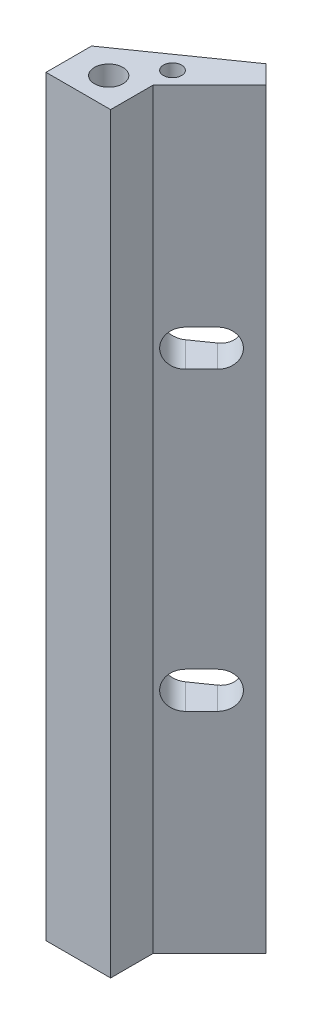
ISO-10303-21;
HEADER;
FILE_DESCRIPTION(('STEP AP214'),'2;1');
FILE_NAME('part.step','',(''),(''),'','','');
FILE_SCHEMA(('AUTOMOTIVE_DESIGN { 1 0 10303 214 1 1 1 1 }'));
ENDSEC;
DATA;
#1=APPLICATION_CONTEXT('core data for automotive mechanical design processes');
#2=APPLICATION_PROTOCOL_DEFINITION('international standard','automotive_design',2000,#1);
#3=PRODUCT_CONTEXT('',#1,'mechanical');
#4=PRODUCT('Part','Part','',(#3));
#5=PRODUCT_RELATED_PRODUCT_CATEGORY('part','',(#4));
#6=PRODUCT_DEFINITION_FORMATION('','',#4);
#7=PRODUCT_DEFINITION_CONTEXT('part definition',#1,'design');
#8=PRODUCT_DEFINITION('design','',#6,#7);
#9=PRODUCT_DEFINITION_SHAPE('','',#8);
#10=(LENGTH_UNIT() NAMED_UNIT(*) SI_UNIT(.MILLI.,.METRE.));
#11=(NAMED_UNIT(*) PLANE_ANGLE_UNIT() SI_UNIT($,.RADIAN.));
#12=(NAMED_UNIT(*) SI_UNIT($,.STERADIAN.) SOLID_ANGLE_UNIT());
#13=UNCERTAINTY_MEASURE_WITH_UNIT(LENGTH_MEASURE(1.E-05),#10,'distance_accuracy_value','');
#14=(GEOMETRIC_REPRESENTATION_CONTEXT(3) GLOBAL_UNCERTAINTY_ASSIGNED_CONTEXT((#13)) GLOBAL_UNIT_ASSIGNED_CONTEXT((#10,
#11,#12)) REPRESENTATION_CONTEXT('',''));
#15=CARTESIAN_POINT('',(0.,0.,0.));
#16=DIRECTION('',(0.,0.,1.));
#17=DIRECTION('',(1.,0.,0.));
#18=AXIS2_PLACEMENT_3D('',#15,#16,#17);
#19=CARTESIAN_POINT('',(4.6187008721053,0.,0.916833034036763));
#20=DIRECTION('',(0.707106781186548,0.,-0.707106781186548));
#21=DIRECTION('',(-0.707106781186548,0.,-0.707106781186548));
#22=AXIS2_PLACEMENT_3D('',#19,#20,#21);
#23=PLANE('',#22);
#24=DIRECTION('',(-0.707106781186548,0.,-0.707106781186548));
#25=VECTOR('',#24,1.);
#26=CARTESIAN_POINT('',(4.6187008721053,66.,0.916833034036763));
#27=LINE('',#26,#25);
#28=CARTESIAN_POINT('',(4.6187008721053,66.,0.916833034036763));
#29=VERTEX_POINT('',#28);
#30=CARTESIAN_POINT('',(2.99999999712652,66.,-0.701867840942023));
#31=VERTEX_POINT('',#30);
#32=EDGE_CURVE('E217',#29,#31,#27,.T.);
#33=ORIENTED_EDGE('',*,*,#32,.F.);
#34=DIRECTION('',(0.,1.,0.));
#35=VECTOR('',#34,1.);
#36=CARTESIAN_POINT('',(4.6187008721053,0.,0.916833034036763));
#37=LINE('',#36,#35);
#38=CARTESIAN_POINT('',(4.6187008721053,0.,0.916833034036763));
#39=VERTEX_POINT('',#38);
#40=EDGE_CURVE('E260',#39,#29,#37,.T.);
#41=ORIENTED_EDGE('',*,*,#40,.F.);
#42=DIRECTION('',(-0.707106781186548,0.,-0.707106781186548));
#43=VECTOR('',#42,1.);
#44=CARTESIAN_POINT('',(4.6187008721053,0.,0.916833034036763));
#45=LINE('',#44,#43);
#46=CARTESIAN_POINT('',(2.99999999712652,0.,-0.701867840942023));
#47=VERTEX_POINT('',#46);
#48=EDGE_CURVE('E224',#39,#47,#45,.T.);
#49=ORIENTED_EDGE('',*,*,#48,.T.);
#50=DIRECTION('',(0.,1.,0.));
#51=VECTOR('',#50,1.);
#52=CARTESIAN_POINT('',(2.99999999712652,0.,-0.701867840942023));
#53=LINE('',#52,#51);
#54=EDGE_CURVE('E243',#47,#31,#53,.T.);
#55=ORIENTED_EDGE('',*,*,#54,.T.);
#56=EDGE_LOOP('',(#33,#41,#49,#55));
#57=FACE_BOUND('',#56,.T.);
#58=ADVANCED_FACE('F32',(#57),#23,.T.);
#59=CARTESIAN_POINT('',(-0.33104659149401,0.,5.86658049763607));
#60=DIRECTION('',(0.707106781186547,0.,0.707106781186547));
#61=DIRECTION('',(0.707106781186548,0.,-0.707106781186548));
#62=AXIS2_PLACEMENT_3D('',#59,#60,#61);
#63=PLANE('',#62);
#64=CARTESIAN_POINT('',(2.49738053104314,19.999999999,3.03815337509892));
#65=DIRECTION('',(0.707106781186548,0.,0.707106781186548));
#66=DIRECTION('',(0.707106781186548,0.,-0.707106781186548));
#67=AXIS2_PLACEMENT_3D('',#64,#65,#66);
#68=CIRCLE('',#67,1.59999999207179);
#69=CARTESIAN_POINT('',(2.49738053104314,18.4000000069282,3.03815337509892));
#70=VERTEX_POINT('',#69);
#71=CARTESIAN_POINT('',(2.49738053104314,21.5999999910718,3.03815337509892));
#72=VERTEX_POINT('',#71);
#73=EDGE_CURVE('E46',#70,#72,#68,.T.);
#74=ORIENTED_EDGE('',*,*,#73,.F.);
#75=DIRECTION('',(0.707106781186547,0.,-0.707106781186548));
#76=VECTOR('',#75,1.);
#77=CARTESIAN_POINT('',(1.08316696903882,18.4000000069282,4.45236693710325));
#78=LINE('',#77,#76);
#79=CARTESIAN_POINT('',(1.08316696903882,18.4000000069282,4.45236693710325));
#80=VERTEX_POINT('',#79);
#81=EDGE_CURVE('E190',#80,#70,#78,.T.);
#82=ORIENTED_EDGE('',*,*,#81,.F.);
#83=CARTESIAN_POINT('',(1.08316696903882,19.999999999,4.45236693710325));
#84=DIRECTION('',(0.707106781186548,0.,0.707106781186548));
#85=DIRECTION('',(0.707106781186548,0.,-0.707106781186548));
#86=AXIS2_PLACEMENT_3D('',#83,#84,#85);
#87=CIRCLE('',#86,1.59999999207179);
#88=CARTESIAN_POINT('',(1.08316696903882,21.5999999910718,4.45236693710325));
#89=VERTEX_POINT('',#88);
#90=EDGE_CURVE('E187',#89,#80,#87,.T.);
#91=ORIENTED_EDGE('',*,*,#90,.F.);
#92=DIRECTION('',(-0.707106781186547,0.,0.707106781186548));
#93=VECTOR('',#92,1.);
#94=CARTESIAN_POINT('',(2.49738053104314,21.5999999910718,3.03815337509892));
#95=LINE('',#94,#93);
#96=EDGE_CURVE('E185',#72,#89,#95,.T.);
#97=ORIENTED_EDGE('',*,*,#96,.F.);
#98=EDGE_LOOP('',(#74,#82,#91,#97));
#99=FACE_BOUND('',#98,.T.);
#100=CARTESIAN_POINT('',(2.49738053104315,46.000000001,3.03815337509892));
#101=DIRECTION('',(0.707106781186548,0.,0.707106781186548));
#102=DIRECTION('',(0.707106781186548,0.,-0.707106781186548));
#103=AXIS2_PLACEMENT_3D('',#100,#101,#102);
#104=CIRCLE('',#103,1.59999999207178);
#105=CARTESIAN_POINT('',(2.49738053104315,44.4000000089282,3.03815337509892));
#106=VERTEX_POINT('',#105);
#107=CARTESIAN_POINT('',(2.49738053104315,47.5999999930718,3.03815337509892));
#108=VERTEX_POINT('',#107);
#109=EDGE_CURVE('E203',#106,#108,#104,.T.);
#110=ORIENTED_EDGE('',*,*,#109,.F.);
#111=DIRECTION('',(0.707106781186547,0.,-0.707106781186548));
#112=VECTOR('',#111,1.);
#113=CARTESIAN_POINT('',(1.08316696903882,44.4000000089282,4.45236693710325));
#114=LINE('',#113,#112);
#115=CARTESIAN_POINT('',(1.08316696903882,44.4000000089282,4.45236693710325));
#116=VERTEX_POINT('',#115);
#117=EDGE_CURVE('E211',#116,#106,#114,.T.);
#118=ORIENTED_EDGE('',*,*,#117,.F.);
#119=CARTESIAN_POINT('',(1.08316696903882,46.000000001,4.45236693710325));
#120=DIRECTION('',(0.707106781186548,0.,0.707106781186548));
#121=DIRECTION('',(0.707106781186548,0.,-0.707106781186548));
#122=AXIS2_PLACEMENT_3D('',#119,#120,#121);
#123=CIRCLE('',#122,1.59999999207178);
#124=CARTESIAN_POINT('',(1.08316696903882,47.5999999930718,4.45236693710325));
#125=VERTEX_POINT('',#124);
#126=EDGE_CURVE('E208',#125,#116,#123,.T.);
#127=ORIENTED_EDGE('',*,*,#126,.F.);
#128=DIRECTION('',(-0.707106781186547,0.,0.707106781186548));
#129=VECTOR('',#128,1.);
#130=CARTESIAN_POINT('',(2.49738053104315,47.5999999930718,3.03815337509892));
#131=LINE('',#130,#129);
#132=EDGE_CURVE('E205',#108,#125,#131,.T.);
#133=ORIENTED_EDGE('',*,*,#132,.F.);
#134=EDGE_LOOP('',(#110,#118,#127,#133));
#135=FACE_BOUND('',#134,.T.);
#136=DIRECTION('',(0.707106781186547,0.,-0.707106781186547));
#137=VECTOR('',#136,1.);
#138=CARTESIAN_POINT('',(-0.33104659149401,66.,5.86658049763607));
#139=LINE('',#138,#137);
#140=CARTESIAN_POINT('',(-0.33104659149401,66.,5.86658049763607));
#141=VERTEX_POINT('',#140);
#142=EDGE_CURVE('E228',#141,#29,#139,.T.);
#143=ORIENTED_EDGE('',*,*,#142,.F.);
#144=DIRECTION('',(0.,1.,0.));
#145=VECTOR('',#144,1.);
#146=CARTESIAN_POINT('',(-0.33104659149401,0.,5.86658049763607));
#147=LINE('',#146,#145);
#148=CARTESIAN_POINT('',(-0.33104659149401,0.,5.86658049763607));
#149=VERTEX_POINT('',#148);
#150=EDGE_CURVE('E263',#149,#141,#147,.T.);
#151=ORIENTED_EDGE('',*,*,#150,.F.);
#152=DIRECTION('',(0.707106781186547,0.,-0.707106781186547));
#153=VECTOR('',#152,1.);
#154=CARTESIAN_POINT('',(-0.33104659149401,0.,5.86658049763607));
#155=LINE('',#154,#153);
#156=EDGE_CURVE('E240',#149,#39,#155,.T.);
#157=ORIENTED_EDGE('',*,*,#156,.T.);
#158=ORIENTED_EDGE('',*,*,#40,.T.);
#159=EDGE_LOOP('',(#143,#151,#157,#158));
#160=FACE_BOUND('',#159,.T.);
#161=ADVANCED_FACE('F298',(#99,#135,#160),#63,.T.);
#162=CARTESIAN_POINT('',(-0.33104659149401,0.,9.6));
#163=DIRECTION('',(1.,0.,0.));
#164=DIRECTION('',(0.,0.,-1.));
#165=AXIS2_PLACEMENT_3D('',#162,#163,#164);
#166=PLANE('',#165);
#167=DIRECTION('',(0.,0.,-1.));
#168=VECTOR('',#167,1.);
#169=CARTESIAN_POINT('',(-0.33104659149401,66.,9.6));
#170=LINE('',#169,#168);
#171=CARTESIAN_POINT('',(-0.33104659149401,66.,9.6));
#172=VERTEX_POINT('',#171);
#173=EDGE_CURVE('E255',#172,#141,#170,.T.);
#174=ORIENTED_EDGE('',*,*,#173,.F.);
#175=DIRECTION('',(0.,1.,0.));
#176=VECTOR('',#175,1.);
#177=CARTESIAN_POINT('',(-0.33104659149401,0.,9.6));
#178=LINE('',#177,#176);
#179=CARTESIAN_POINT('',(-0.33104659149401,0.,9.6));
#180=VERTEX_POINT('',#179);
#181=EDGE_CURVE('E265',#180,#172,#178,.T.);
#182=ORIENTED_EDGE('',*,*,#181,.F.);
#183=DIRECTION('',(0.,0.,-1.));
#184=VECTOR('',#183,1.);
#185=CARTESIAN_POINT('',(-0.33104659149401,0.,9.6));
#186=LINE('',#185,#184);
#187=EDGE_CURVE('E237',#180,#149,#186,.T.);
#188=ORIENTED_EDGE('',*,*,#187,.T.);
#189=ORIENTED_EDGE('',*,*,#150,.T.);
#190=EDGE_LOOP('',(#174,#182,#188,#189));
#191=FACE_BOUND('',#190,.T.);
#192=ADVANCED_FACE('F301',(#191),#166,.T.);
#193=CARTESIAN_POINT('',(-6.,0.,9.6));
#194=DIRECTION('',(0.,0.,1.));
#195=DIRECTION('',(1.,0.,0.));
#196=AXIS2_PLACEMENT_3D('',#193,#194,#195);
#197=PLANE('',#196);
#198=DIRECTION('',(1.,0.,0.));
#199=VECTOR('',#198,1.);
#200=CARTESIAN_POINT('',(-6.,66.,9.6));
#201=LINE('',#200,#199);
#202=CARTESIAN_POINT('',(-6.,66.,9.6));
#203=VERTEX_POINT('',#202);
#204=EDGE_CURVE('E252',#203,#172,#201,.T.);
#205=ORIENTED_EDGE('',*,*,#204,.F.);
#206=DIRECTION('',(0.,1.,0.));
#207=VECTOR('',#206,1.);
#208=CARTESIAN_POINT('',(-6.,0.,9.6));
#209=LINE('',#208,#207);
#210=CARTESIAN_POINT('',(-6.,0.,9.6));
#211=VERTEX_POINT('',#210);
#212=EDGE_CURVE('E267',#211,#203,#209,.T.);
#213=ORIENTED_EDGE('',*,*,#212,.F.);
#214=DIRECTION('',(1.,0.,0.));
#215=VECTOR('',#214,1.);
#216=CARTESIAN_POINT('',(-6.,0.,9.6));
#217=LINE('',#216,#215);
#218=EDGE_CURVE('E234',#211,#180,#217,.T.);
#219=ORIENTED_EDGE('',*,*,#218,.T.);
#220=ORIENTED_EDGE('',*,*,#181,.T.);
#221=EDGE_LOOP('',(#205,#213,#219,#220));
#222=FACE_BOUND('',#221,.T.);
#223=ADVANCED_FACE('F325',(#222),#197,.T.);
#224=CARTESIAN_POINT('',(-6.,0.,5.59999999748528));
#225=DIRECTION('',(-1.,0.,0.));
#226=DIRECTION('',(0.,0.,1.));
#227=AXIS2_PLACEMENT_3D('',#224,#225,#226);
#228=PLANE('',#227);
#229=DIRECTION('',(0.,0.,1.));
#230=VECTOR('',#229,1.);
#231=CARTESIAN_POINT('',(-6.,66.,5.59999999748528));
#232=LINE('',#231,#230);
#233=CARTESIAN_POINT('',(-6.,66.,5.59999999748528));
#234=VERTEX_POINT('',#233);
#235=EDGE_CURVE('E249',#234,#203,#232,.T.);
#236=ORIENTED_EDGE('',*,*,#235,.F.);
#237=DIRECTION('',(0.,1.,0.));
#238=VECTOR('',#237,1.);
#239=CARTESIAN_POINT('',(-6.,0.,5.59999999748528));
#240=LINE('',#239,#238);
#241=CARTESIAN_POINT('',(-6.,0.,5.59999999748528));
#242=VERTEX_POINT('',#241);
#243=EDGE_CURVE('E269',#242,#234,#240,.T.);
#244=ORIENTED_EDGE('',*,*,#243,.F.);
#245=DIRECTION('',(0.,0.,1.));
#246=VECTOR('',#245,1.);
#247=CARTESIAN_POINT('',(-6.,0.,5.59999999748528));
#248=LINE('',#247,#246);
#249=EDGE_CURVE('E231',#242,#211,#248,.T.);
#250=ORIENTED_EDGE('',*,*,#249,.T.);
#251=ORIENTED_EDGE('',*,*,#212,.T.);
#252=EDGE_LOOP('',(#236,#244,#250,#251));
#253=FACE_BOUND('',#252,.T.);
#254=ADVANCED_FACE('F323',(#253),#228,.T.);
#255=CARTESIAN_POINT('',(2.99999999712652,0.,-0.701867840942023));
#256=DIRECTION('',(-0.573576436140462,0.,-0.819152044436444));
#257=DIRECTION('',(-0.819152044436444,0.,0.573576436140462));
#258=AXIS2_PLACEMENT_3D('',#255,#256,#257);
#259=PLANE('',#258);
#260=CARTESIAN_POINT('',(0.504633644647122,19.999999999,1.0454064887029));
#261=DIRECTION('',(-0.573576436140462,0.,-0.819152044436444));
#262=DIRECTION('',(0.819152044436444,0.,-0.573576436140462));
#263=AXIS2_PLACEMENT_3D('',#260,#261,#262);
#264=ELLIPSE('',#263,1.62468257104032,1.59999999207179);
#265=CARTESIAN_POINT('',(0.504633644647122,18.4000000069282,1.0454064887029));
#266=VERTEX_POINT('',#265);
#267=CARTESIAN_POINT('',(0.504633644647121,21.5999999910718,1.0454064887029));
#268=VERTEX_POINT('',#267);
#269=EDGE_CURVE('E181',#266,#268,#264,.F.);
#270=ORIENTED_EDGE('',*,*,#269,.T.);
#271=DIRECTION('',(-0.819152044436444,0.,0.573576436140462));
#272=VECTOR('',#271,1.);
#273=CARTESIAN_POINT('',(-0.32555994335472,21.5999999910718,1.62671429687709));
#274=LINE('',#273,#272);
#275=CARTESIAN_POINT('',(-1.15894392519726,21.5999999910718,2.21025604286718));
#276=VERTEX_POINT('',#275);
#277=EDGE_CURVE('E196',#268,#276,#274,.T.);
#278=ORIENTED_EDGE('',*,*,#277,.T.);
#279=CARTESIAN_POINT('',(-1.15894392519726,19.999999999,2.21025604286718));
#280=DIRECTION('',(-0.573576436140462,0.,-0.819152044436444));
#281=DIRECTION('',(0.819152044436444,0.,-0.573576436140462));
#282=AXIS2_PLACEMENT_3D('',#279,#280,#281);
#283=ELLIPSE('',#282,1.62468257104032,1.59999999207179);
#284=CARTESIAN_POINT('',(-1.15894392519726,18.4000000069282,2.21025604286718));
#285=VERTEX_POINT('',#284);
#286=EDGE_CURVE('E175',#276,#285,#283,.F.);
#287=ORIENTED_EDGE('',*,*,#286,.T.);
#288=DIRECTION('',(0.819152044436444,0.,-0.573576436140462));
#289=VECTOR('',#288,1.);
#290=CARTESIAN_POINT('',(-1.9389745113745,18.4000000069282,2.75643933904378));
#291=LINE('',#290,#289);
#292=EDGE_CURVE('E178',#285,#266,#291,.T.);
#293=ORIENTED_EDGE('',*,*,#292,.T.);
#294=EDGE_LOOP('',(#270,#278,#287,#293));
#295=FACE_BOUND('',#294,.T.);
#296=CARTESIAN_POINT('',(0.504633644647123,46.000000001,1.0454064887029));
#297=DIRECTION('',(-0.573576436140462,0.,-0.819152044436444));
#298=DIRECTION('',(0.819152044436444,0.,-0.573576436140462));
#299=AXIS2_PLACEMENT_3D('',#296,#297,#298);
#300=ELLIPSE('',#299,1.62468257104031,1.59999999207178);
#301=CARTESIAN_POINT('',(0.504633644647122,47.5999999930718,1.0454064887029));
#302=VERTEX_POINT('',#301);
#303=CARTESIAN_POINT('',(0.504633644647121,44.4000000089282,1.0454064887029));
#304=VERTEX_POINT('',#303);
#305=EDGE_CURVE('E11',#302,#304,#300,.T.);
#306=ORIENTED_EDGE('',*,*,#305,.F.);
#307=DIRECTION('',(0.819152044436444,0.,-0.573576436140462));
#308=VECTOR('',#307,1.);
#309=CARTESIAN_POINT('',(2.99999999712652,47.5999999930718,-0.701867840942023));
#310=LINE('',#309,#308);
#311=CARTESIAN_POINT('',(-1.15894392519726,47.5999999930718,2.21025604286718));
#312=VERTEX_POINT('',#311);
#313=EDGE_CURVE('E262',#312,#302,#310,.T.);
#314=ORIENTED_EDGE('',*,*,#313,.F.);
#315=CARTESIAN_POINT('',(-1.15894392519725,46.000000001,2.21025604286718));
#316=DIRECTION('',(-0.573576436140462,0.,-0.819152044436444));
#317=DIRECTION('',(0.819152044436444,0.,-0.573576436140462));
#318=AXIS2_PLACEMENT_3D('',#315,#316,#317);
#319=ELLIPSE('',#318,1.62468257104032,1.59999999207178);
#320=CARTESIAN_POINT('',(-1.15894392519725,44.4000000089282,2.21025604286718));
#321=VERTEX_POINT('',#320);
#322=EDGE_CURVE('E273',#321,#312,#319,.T.);
#323=ORIENTED_EDGE('',*,*,#322,.F.);
#324=DIRECTION('',(-0.819152044436444,0.,0.573576436140462));
#325=VECTOR('',#324,1.);
#326=CARTESIAN_POINT('',(2.99999999712627,44.4000000089283,-0.701867840941849));
#327=LINE('',#326,#325);
#328=EDGE_CURVE('E39',#304,#321,#327,.T.);
#329=ORIENTED_EDGE('',*,*,#328,.F.);
#330=EDGE_LOOP('',(#306,#314,#323,#329));
#331=FACE_BOUND('',#330,.T.);
#332=DIRECTION('',(-0.819152044436444,0.,0.573576436140462));
#333=VECTOR('',#332,1.);
#334=CARTESIAN_POINT('',(2.99999999712652,66.,-0.701867840942023));
#335=LINE('',#334,#333);
#336=EDGE_CURVE('E246',#31,#234,#335,.T.);
#337=ORIENTED_EDGE('',*,*,#336,.F.);
#338=ORIENTED_EDGE('',*,*,#54,.F.);
#339=DIRECTION('',(-0.819152044436444,0.,0.573576436140462));
#340=VECTOR('',#339,1.);
#341=CARTESIAN_POINT('',(2.99999999712652,0.,-0.701867840942023));
#342=LINE('',#341,#340);
#343=EDGE_CURVE('E227',#47,#242,#342,.T.);
#344=ORIENTED_EDGE('',*,*,#343,.T.);
#345=ORIENTED_EDGE('',*,*,#243,.T.);
#346=EDGE_LOOP('',(#337,#338,#344,#345));
#347=FACE_BOUND('',#346,.T.);
#348=ADVANCED_FACE('F288',(#295,#331,#347),#259,.T.);
#349=CARTESIAN_POINT('',(0.,0.,0.));
#350=DIRECTION('',(0.,-1.,0.));
#351=DIRECTION('',(0.,0.,-1.));
#352=AXIS2_PLACEMENT_3D('',#349,#350,#351);
#353=PLANE('',#352);
#354=CARTESIAN_POINT('',(-0.604004818,0.,3.897000298));
#355=DIRECTION('',(0.,-1.,0.));
#356=DIRECTION('',(0.,0.,-1.));
#357=AXIS2_PLACEMENT_3D('',#354,#355,#356);
#358=CIRCLE('',#357,0.8);
#359=CARTESIAN_POINT('',(-0.604004818,0.,3.097000298));
#360=VERTEX_POINT('',#359);
#361=EDGE_CURVE('E163',#360,#360,#358,.T.);
#362=ORIENTED_EDGE('',*,*,#361,.F.);
#363=EDGE_LOOP('',(#362));
#364=FACE_BOUND('',#363,.T.);
#365=CARTESIAN_POINT('',(-3.,0.,7.1));
#366=DIRECTION('',(0.,-1.,0.));
#367=DIRECTION('',(0.,0.,-1.));
#368=AXIS2_PLACEMENT_3D('',#365,#366,#367);
#369=CIRCLE('',#368,1.24999999999999);
#370=CARTESIAN_POINT('',(-3.,0.,5.85000000000001));
#371=VERTEX_POINT('',#370);
#372=EDGE_CURVE('E169',#371,#371,#369,.T.);
#373=ORIENTED_EDGE('',*,*,#372,.F.);
#374=EDGE_LOOP('',(#373));
#375=FACE_BOUND('',#374,.T.);
#376=ORIENTED_EDGE('',*,*,#48,.F.);
#377=ORIENTED_EDGE('',*,*,#156,.F.);
#378=ORIENTED_EDGE('',*,*,#187,.F.);
#379=ORIENTED_EDGE('',*,*,#218,.F.);
#380=ORIENTED_EDGE('',*,*,#249,.F.);
#381=ORIENTED_EDGE('',*,*,#343,.F.);
#382=EDGE_LOOP('',(#376,#377,#378,#379,#380,#381));
#383=FACE_BOUND('',#382,.T.);
#384=ADVANCED_FACE('F316',(#364,#375,#383),#353,.T.);
#385=CARTESIAN_POINT('',(0.,66.,0.));
#386=DIRECTION('',(0.,-1.,0.));
#387=DIRECTION('',(0.,0.,-1.));
#388=AXIS2_PLACEMENT_3D('',#385,#386,#387);
#389=PLANE('',#388);
#390=CARTESIAN_POINT('',(-0.604004818,66.,3.897000298));
#391=DIRECTION('',(0.,1.,0.));
#392=DIRECTION('',(0.,0.,1.));
#393=AXIS2_PLACEMENT_3D('',#390,#391,#392);
#394=CIRCLE('',#393,0.799999999999999);
#395=CARTESIAN_POINT('',(-0.604004818,66.,4.697000298));
#396=VERTEX_POINT('',#395);
#397=EDGE_CURVE('E153',#396,#396,#394,.T.);
#398=ORIENTED_EDGE('',*,*,#397,.F.);
#399=EDGE_LOOP('',(#398));
#400=FACE_BOUND('',#399,.T.);
#401=CARTESIAN_POINT('',(-3.,66.,7.1));
#402=DIRECTION('',(0.,1.,0.));
#403=DIRECTION('',(0.,0.,1.));
#404=AXIS2_PLACEMENT_3D('',#401,#402,#403);
#405=CIRCLE('',#404,1.24999999999999);
#406=CARTESIAN_POINT('',(-3.,66.,8.34999999999999));
#407=VERTEX_POINT('',#406);
#408=EDGE_CURVE('E152',#407,#407,#405,.T.);
#409=ORIENTED_EDGE('',*,*,#408,.F.);
#410=EDGE_LOOP('',(#409));
#411=FACE_BOUND('',#410,.T.);
#412=ORIENTED_EDGE('',*,*,#32,.T.);
#413=ORIENTED_EDGE('',*,*,#336,.T.);
#414=ORIENTED_EDGE('',*,*,#235,.T.);
#415=ORIENTED_EDGE('',*,*,#204,.T.);
#416=ORIENTED_EDGE('',*,*,#173,.T.);
#417=ORIENTED_EDGE('',*,*,#142,.T.);
#418=EDGE_LOOP('',(#412,#413,#414,#415,#416,#417));
#419=FACE_BOUND('',#418,.T.);
#420=ADVANCED_FACE('F307',(#400,#411,#419),#389,.F.);
#421=CARTESIAN_POINT('',(-3.6213203424989,46.000000001,-3.08054749844312));
#422=DIRECTION('',(0.707106781186548,0.,0.707106781186548));
#423=DIRECTION('',(0.707106781186548,0.,-0.707106781186548));
#424=AXIS2_PLACEMENT_3D('',#421,#422,#423);
#425=CYLINDRICAL_SURFACE('',#424,1.59999999207178);
#426=ORIENTED_EDGE('',*,*,#305,.T.);
#427=DIRECTION('',(0.707106781186548,0.,0.707106781186548));
#428=VECTOR('',#427,1.);
#429=CARTESIAN_POINT('',(-3.6213203424989,44.4000000089282,-3.08054749844312));
#430=LINE('',#429,#428);
#431=EDGE_CURVE('E215',#304,#106,#430,.T.);
#432=ORIENTED_EDGE('',*,*,#431,.T.);
#433=ORIENTED_EDGE('',*,*,#109,.T.);
#434=DIRECTION('',(0.707106781186548,0.,0.707106781186548));
#435=VECTOR('',#434,1.);
#436=CARTESIAN_POINT('',(-3.6213203424989,47.5999999930718,-3.08054749844312));
#437=LINE('',#436,#435);
#438=EDGE_CURVE('E214',#302,#108,#437,.T.);
#439=ORIENTED_EDGE('',*,*,#438,.F.);
#440=EDGE_LOOP('',(#426,#432,#433,#439));
#441=FACE_BOUND('',#440,.T.);
#442=ADVANCED_FACE('F295',(#441),#425,.F.);
#443=CARTESIAN_POINT('',(-5.03553390450323,44.4000000089282,-1.6663339364388));
#444=DIRECTION('',(0.,-1.,0.));
#445=DIRECTION('',(0.,0.,-1.));
#446=AXIS2_PLACEMENT_3D('',#443,#444,#445);
#447=PLANE('',#446);
#448=ORIENTED_EDGE('',*,*,#328,.T.);
#449=DIRECTION('',(0.707106781186548,0.,0.707106781186548));
#450=VECTOR('',#449,1.);
#451=CARTESIAN_POINT('',(-5.03553390450323,44.4000000089282,-1.6663339364388));
#452=LINE('',#451,#450);
#453=EDGE_CURVE('E218',#321,#116,#452,.T.);
#454=ORIENTED_EDGE('',*,*,#453,.T.);
#455=ORIENTED_EDGE('',*,*,#117,.T.);
#456=ORIENTED_EDGE('',*,*,#431,.F.);
#457=EDGE_LOOP('',(#448,#454,#455,#456));
#458=FACE_BOUND('',#457,.T.);
#459=ADVANCED_FACE('F279',(#458),#447,.F.);
#460=CARTESIAN_POINT('',(-5.03553390450323,46.000000001,-1.6663339364388));
#461=DIRECTION('',(0.707106781186548,0.,0.707106781186548));
#462=DIRECTION('',(0.707106781186548,0.,-0.707106781186548));
#463=AXIS2_PLACEMENT_3D('',#460,#461,#462);
#464=CYLINDRICAL_SURFACE('',#463,1.59999999207178);
#465=ORIENTED_EDGE('',*,*,#322,.T.);
#466=DIRECTION('',(0.707106781186548,0.,0.707106781186548));
#467=VECTOR('',#466,1.);
#468=CARTESIAN_POINT('',(-5.03553390450323,47.5999999930718,-1.6663339364388));
#469=LINE('',#468,#467);
#470=EDGE_CURVE('E220',#312,#125,#469,.T.);
#471=ORIENTED_EDGE('',*,*,#470,.T.);
#472=ORIENTED_EDGE('',*,*,#126,.T.);
#473=ORIENTED_EDGE('',*,*,#453,.F.);
#474=EDGE_LOOP('',(#465,#471,#472,#473));
#475=FACE_BOUND('',#474,.T.);
#476=ADVANCED_FACE('F284',(#475),#464,.F.);
#477=CARTESIAN_POINT('',(-3.6213203424989,47.5999999930718,-3.08054749844312));
#478=DIRECTION('',(0.,1.,0.));
#479=DIRECTION('',(0.,0.,1.));
#480=AXIS2_PLACEMENT_3D('',#477,#478,#479);
#481=PLANE('',#480);
#482=ORIENTED_EDGE('',*,*,#313,.T.);
#483=ORIENTED_EDGE('',*,*,#438,.T.);
#484=ORIENTED_EDGE('',*,*,#132,.T.);
#485=ORIENTED_EDGE('',*,*,#470,.F.);
#486=EDGE_LOOP('',(#482,#483,#484,#485));
#487=FACE_BOUND('',#486,.T.);
#488=ADVANCED_FACE('F292',(#487),#481,.F.);
#489=CARTESIAN_POINT('',(-3.6223203424989,19.999999999,-3.08154749844312));
#490=DIRECTION('',(0.707106781186548,0.,0.707106781186548));
#491=DIRECTION('',(0.707106781186548,0.,-0.707106781186548));
#492=AXIS2_PLACEMENT_3D('',#489,#490,#491);
#493=CYLINDRICAL_SURFACE('',#492,1.59999999207179);
#494=DIRECTION('',(0.707106781186548,0.,0.707106781186548));
#495=VECTOR('',#494,1.);
#496=CARTESIAN_POINT('',(-3.6223203424989,18.4000000069282,-3.08154749844312));
#497=LINE('',#496,#495);
#498=EDGE_CURVE('E194',#266,#70,#497,.T.);
#499=ORIENTED_EDGE('',*,*,#498,.T.);
#500=ORIENTED_EDGE('',*,*,#73,.T.);
#501=DIRECTION('',(0.707106781186548,0.,0.707106781186548));
#502=VECTOR('',#501,1.);
#503=CARTESIAN_POINT('',(-3.6223203424989,21.5999999910718,-3.08154749844312));
#504=LINE('',#503,#502);
#505=EDGE_CURVE('E193',#268,#72,#504,.T.);
#506=ORIENTED_EDGE('',*,*,#505,.F.);
#507=ORIENTED_EDGE('',*,*,#269,.F.);
#508=EDGE_LOOP('',(#499,#500,#506,#507));
#509=FACE_BOUND('',#508,.T.);
#510=ADVANCED_FACE('F392',(#509),#493,.F.);
#511=CARTESIAN_POINT('',(-5.03653390450323,18.4000000069282,-1.66733393643879));
#512=DIRECTION('',(0.,-1.,0.));
#513=DIRECTION('',(0.,0.,-1.));
#514=AXIS2_PLACEMENT_3D('',#511,#512,#513);
#515=PLANE('',#514);
#516=DIRECTION('',(0.707106781186548,0.,0.707106781186548));
#517=VECTOR('',#516,1.);
#518=CARTESIAN_POINT('',(-5.03653390450323,18.4000000069282,-1.66733393643879));
#519=LINE('',#518,#517);
#520=EDGE_CURVE('E197',#285,#80,#519,.T.);
#521=ORIENTED_EDGE('',*,*,#520,.T.);
#522=ORIENTED_EDGE('',*,*,#81,.T.);
#523=ORIENTED_EDGE('',*,*,#498,.F.);
#524=ORIENTED_EDGE('',*,*,#292,.F.);
#525=EDGE_LOOP('',(#521,#522,#523,#524));
#526=FACE_BOUND('',#525,.T.);
#527=ADVANCED_FACE('F402',(#526),#515,.F.);
#528=CARTESIAN_POINT('',(-5.03653390450323,19.999999999,-1.66733393643879));
#529=DIRECTION('',(0.707106781186548,0.,0.707106781186548));
#530=DIRECTION('',(0.707106781186548,0.,-0.707106781186548));
#531=AXIS2_PLACEMENT_3D('',#528,#529,#530);
#532=CYLINDRICAL_SURFACE('',#531,1.59999999207179);
#533=DIRECTION('',(0.707106781186548,0.,0.707106781186548));
#534=VECTOR('',#533,1.);
#535=CARTESIAN_POINT('',(-5.03653390450323,21.5999999910718,-1.66733393643879));
#536=LINE('',#535,#534);
#537=EDGE_CURVE('E54',#276,#89,#536,.T.);
#538=ORIENTED_EDGE('',*,*,#537,.T.);
#539=ORIENTED_EDGE('',*,*,#90,.T.);
#540=ORIENTED_EDGE('',*,*,#520,.F.);
#541=ORIENTED_EDGE('',*,*,#286,.F.);
#542=EDGE_LOOP('',(#538,#539,#540,#541));
#543=FACE_BOUND('',#542,.T.);
#544=ADVANCED_FACE('F408',(#543),#532,.F.);
#545=CARTESIAN_POINT('',(-3.6223203424989,21.5999999910718,-3.08154749844312));
#546=DIRECTION('',(0.,1.,0.));
#547=DIRECTION('',(0.,0.,1.));
#548=AXIS2_PLACEMENT_3D('',#545,#546,#547);
#549=PLANE('',#548);
#550=ORIENTED_EDGE('',*,*,#505,.T.);
#551=ORIENTED_EDGE('',*,*,#96,.T.);
#552=ORIENTED_EDGE('',*,*,#537,.F.);
#553=ORIENTED_EDGE('',*,*,#277,.F.);
#554=EDGE_LOOP('',(#550,#551,#552,#553));
#555=FACE_BOUND('',#554,.T.);
#556=ADVANCED_FACE('F416',(#555),#549,.F.);
#557=CARTESIAN_POINT('',(-3.,7.99999999999999,7.1));
#558=DIRECTION('',(0.,-1.,0.));
#559=DIRECTION('',(0.,0.,-1.));
#560=AXIS2_PLACEMENT_3D('',#557,#558,#559);
#561=CONICAL_SURFACE('',#560,1.24999999999999,1.02974425854996);
#562=CARTESIAN_POINT('',(-3.,8.75107577399999,7.1));
#563=VERTEX_POINT('',#562);
#564=VERTEX_LOOP('',#563);
#565=FACE_BOUND('',#564,.T.);
#566=CARTESIAN_POINT('',(-3.,7.99999999999999,7.1));
#567=DIRECTION('',(0.,-1.,0.));
#568=DIRECTION('',(0.,0.,-1.));
#569=AXIS2_PLACEMENT_3D('',#566,#567,#568);
#570=CIRCLE('',#569,1.24999999999999);
#571=CARTESIAN_POINT('',(-3.,7.99999999999999,5.85000000000001));
#572=VERTEX_POINT('',#571);
#573=EDGE_CURVE('E172',#572,#572,#570,.T.);
#574=ORIENTED_EDGE('',*,*,#573,.T.);
#575=EDGE_LOOP('',(#574));
#576=FACE_BOUND('',#575,.T.);
#577=ADVANCED_FACE('F424',(#565,#576),#561,.F.);
#578=CARTESIAN_POINT('',(-3.,0.,7.1));
#579=DIRECTION('',(0.,-1.,0.));
#580=DIRECTION('',(0.,0.,-1.));
#581=AXIS2_PLACEMENT_3D('',#578,#579,#580);
#582=CYLINDRICAL_SURFACE('',#581,1.24999999999999);
#583=ORIENTED_EDGE('',*,*,#573,.F.);
#584=EDGE_LOOP('',(#583));
#585=FACE_BOUND('',#584,.T.);
#586=ORIENTED_EDGE('',*,*,#372,.T.);
#587=EDGE_LOOP('',(#586));
#588=FACE_BOUND('',#587,.T.);
#589=ADVANCED_FACE('F431',(#585,#588),#582,.F.);
#590=CARTESIAN_POINT('',(-0.604004818,8.,3.897000298));
#591=DIRECTION('',(0.,-1.,0.));
#592=DIRECTION('',(0.,0.,-1.));
#593=AXIS2_PLACEMENT_3D('',#590,#591,#592);
#594=CONICAL_SURFACE('',#593,0.799999999999999,1.02974425867665);
#595=CARTESIAN_POINT('',(-0.604004818000002,8.48068849522205,3.897000298));
#596=VERTEX_POINT('',#595);
#597=VERTEX_LOOP('',#596);
#598=FACE_BOUND('',#597,.T.);
#599=CARTESIAN_POINT('',(-0.604004818,8.,3.897000298));
#600=DIRECTION('',(0.,-1.,0.));
#601=DIRECTION('',(0.,0.,-1.));
#602=AXIS2_PLACEMENT_3D('',#599,#600,#601);
#603=CIRCLE('',#602,0.799999999999999);
#604=CARTESIAN_POINT('',(-0.604004818,8.,3.097000298));
#605=VERTEX_POINT('',#604);
#606=EDGE_CURVE('E166',#605,#605,#603,.T.);
#607=ORIENTED_EDGE('',*,*,#606,.T.);
#608=EDGE_LOOP('',(#607));
#609=FACE_BOUND('',#608,.T.);
#610=ADVANCED_FACE('F439',(#598,#609),#594,.F.);
#611=CARTESIAN_POINT('',(-0.604004818,0.,3.897000298));
#612=DIRECTION('',(0.,-1.,0.));
#613=DIRECTION('',(0.,0.,-1.));
#614=AXIS2_PLACEMENT_3D('',#611,#612,#613);
#615=CYLINDRICAL_SURFACE('',#614,0.799999999999999);
#616=ORIENTED_EDGE('',*,*,#606,.F.);
#617=EDGE_LOOP('',(#616));
#618=FACE_BOUND('',#617,.T.);
#619=ORIENTED_EDGE('',*,*,#361,.T.);
#620=EDGE_LOOP('',(#619));
#621=FACE_BOUND('',#620,.T.);
#622=ADVANCED_FACE('F448',(#618,#621),#615,.F.);
#623=CARTESIAN_POINT('',(-3.,58.,7.1));
#624=DIRECTION('',(0.,1.,0.));
#625=DIRECTION('',(0.,0.,1.));
#626=AXIS2_PLACEMENT_3D('',#623,#624,#625);
#627=CONICAL_SURFACE('',#626,1.24999999999999,1.02974425854995);
#628=CARTESIAN_POINT('',(-3.,57.248924226,7.1));
#629=VERTEX_POINT('',#628);
#630=VERTEX_LOOP('',#629);
#631=FACE_BOUND('',#630,.T.);
#632=CARTESIAN_POINT('',(-3.,58.,7.1));
#633=DIRECTION('',(0.,1.,0.));
#634=DIRECTION('',(0.,0.,1.));
#635=AXIS2_PLACEMENT_3D('',#632,#633,#634);
#636=CIRCLE('',#635,1.24999999999999);
#637=CARTESIAN_POINT('',(-3.,58.,8.34999999999999));
#638=VERTEX_POINT('',#637);
#639=EDGE_CURVE('E156',#638,#638,#636,.T.);
#640=ORIENTED_EDGE('',*,*,#639,.T.);
#641=EDGE_LOOP('',(#640));
#642=FACE_BOUND('',#641,.T.);
#643=ADVANCED_FACE('F456',(#631,#642),#627,.F.);
#644=CARTESIAN_POINT('',(-3.,66.,7.1));
#645=DIRECTION('',(0.,1.,0.));
#646=DIRECTION('',(0.,0.,1.));
#647=AXIS2_PLACEMENT_3D('',#644,#645,#646);
#648=CYLINDRICAL_SURFACE('',#647,1.24999999999999);
#649=ORIENTED_EDGE('',*,*,#639,.F.);
#650=EDGE_LOOP('',(#649));
#651=FACE_BOUND('',#650,.T.);
#652=ORIENTED_EDGE('',*,*,#408,.T.);
#653=EDGE_LOOP('',(#652));
#654=FACE_BOUND('',#653,.T.);
#655=ADVANCED_FACE('F146',(#651,#654),#648,.F.);
#656=CARTESIAN_POINT('',(-0.604004818,58.,3.897000298));
#657=DIRECTION('',(0.,1.,0.));
#658=DIRECTION('',(0.,0.,1.));
#659=AXIS2_PLACEMENT_3D('',#656,#657,#658);
#660=CONICAL_SURFACE('',#659,0.799999999999998,1.02974425867665);
#661=CARTESIAN_POINT('',(-0.604004818000002,57.519311504778,3.897000298));
#662=VERTEX_POINT('',#661);
#663=VERTEX_LOOP('',#662);
#664=FACE_BOUND('',#663,.T.);
#665=CARTESIAN_POINT('',(-0.604004818,58.,3.897000298));
#666=DIRECTION('',(0.,1.,0.));
#667=DIRECTION('',(0.,0.,1.));
#668=AXIS2_PLACEMENT_3D('',#665,#666,#667);
#669=CIRCLE('',#668,0.799999999999998);
#670=CARTESIAN_POINT('',(-0.604004818,58.,4.697000298));
#671=VERTEX_POINT('',#670);
#672=EDGE_CURVE('E150',#671,#671,#669,.T.);
#673=ORIENTED_EDGE('',*,*,#672,.T.);
#674=EDGE_LOOP('',(#673));
#675=FACE_BOUND('',#674,.T.);
#676=ADVANCED_FACE('F142',(#664,#675),#660,.F.);
#677=CARTESIAN_POINT('',(-0.604004818,66.,3.897000298));
#678=DIRECTION('',(0.,1.,0.));
#679=DIRECTION('',(0.,0.,1.));
#680=AXIS2_PLACEMENT_3D('',#677,#678,#679);
#681=CYLINDRICAL_SURFACE('',#680,0.799999999999998);
#682=ORIENTED_EDGE('',*,*,#672,.F.);
#683=EDGE_LOOP('',(#682));
#684=FACE_BOUND('',#683,.T.);
#685=ORIENTED_EDGE('',*,*,#397,.T.);
#686=EDGE_LOOP('',(#685));
#687=FACE_BOUND('',#686,.T.);
#688=ADVANCED_FACE('F145',(#684,#687),#681,.F.);
#689=CLOSED_SHELL('',(#58,#161,#192,#223,#254,#348,#384,#420,#442,#459,#476,#488,#510,#527,#544,
#556,#577,#589,#610,#622,#643,#655,#676,#688));
#690=MANIFOLD_SOLID_BREP('B2',#689);
#691=ADVANCED_BREP_SHAPE_REPRESENTATION('',(#18,#690),#14);
#692=SHAPE_DEFINITION_REPRESENTATION(#9,#691);
ENDSEC;
END-ISO-10303-21;
